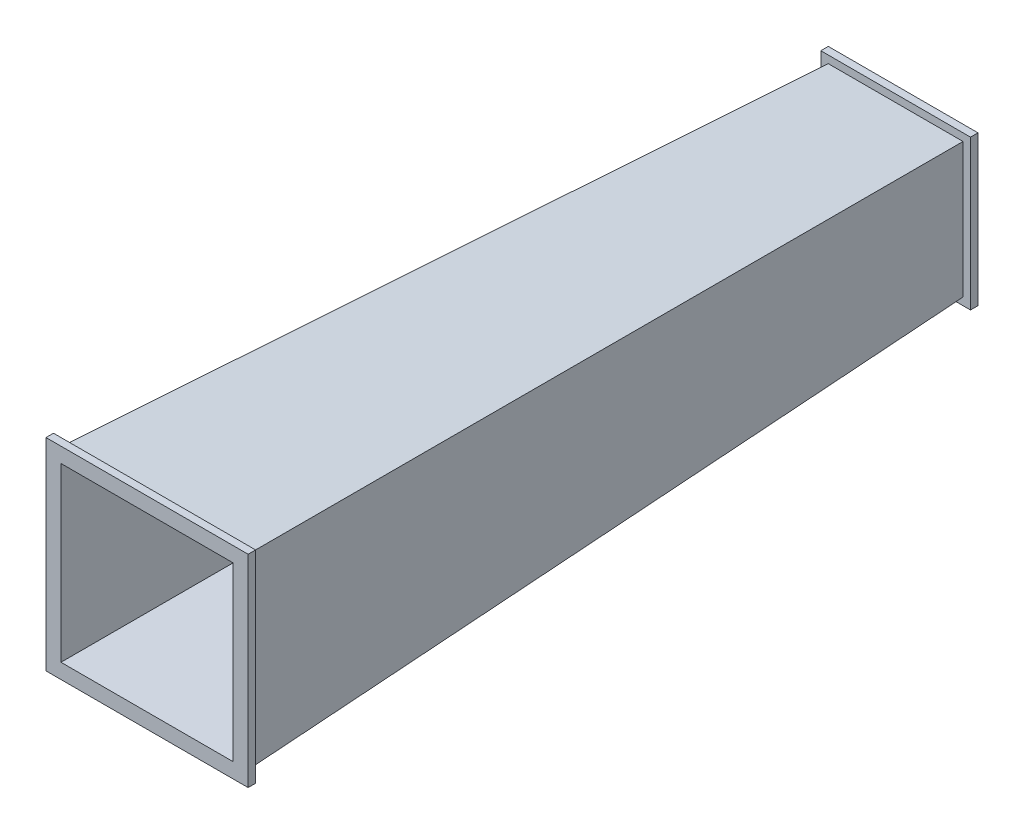
ISO-10303-21;
HEADER;
FILE_DESCRIPTION(('STEP AP214'),'2;1');
FILE_NAME('part.step','',(''),(''),'','','');
FILE_SCHEMA(('AUTOMOTIVE_DESIGN { 1 0 10303 214 1 1 1 1 }'));
ENDSEC;
DATA;
#1=APPLICATION_CONTEXT('core data for automotive mechanical design processes');
#2=APPLICATION_PROTOCOL_DEFINITION('international standard','automotive_design',2000,#1);
#3=PRODUCT_CONTEXT('',#1,'mechanical');
#4=PRODUCT('Part','Part','',(#3));
#5=PRODUCT_RELATED_PRODUCT_CATEGORY('part','',(#4));
#6=PRODUCT_DEFINITION_FORMATION('','',#4);
#7=PRODUCT_DEFINITION_CONTEXT('part definition',#1,'design');
#8=PRODUCT_DEFINITION('design','',#6,#7);
#9=PRODUCT_DEFINITION_SHAPE('','',#8);
#10=(LENGTH_UNIT() NAMED_UNIT(*) SI_UNIT(.MILLI.,.METRE.));
#11=(NAMED_UNIT(*) PLANE_ANGLE_UNIT() SI_UNIT($,.RADIAN.));
#12=(NAMED_UNIT(*) SI_UNIT($,.STERADIAN.) SOLID_ANGLE_UNIT());
#13=UNCERTAINTY_MEASURE_WITH_UNIT(LENGTH_MEASURE(1.E-05),#10,'distance_accuracy_value','');
#14=(GEOMETRIC_REPRESENTATION_CONTEXT(3) GLOBAL_UNCERTAINTY_ASSIGNED_CONTEXT((#13)) GLOBAL_UNIT_ASSIGNED_CONTEXT((#10,
#11,#12)) REPRESENTATION_CONTEXT('',''));
#15=CARTESIAN_POINT('',(0.,0.,0.));
#16=DIRECTION('',(0.,0.,1.));
#17=DIRECTION('',(1.,0.,0.));
#18=AXIS2_PLACEMENT_3D('',#15,#16,#17);
#19=CARTESIAN_POINT('',(0.,0.,-5.));
#20=DIRECTION('',(0.,0.,-1.));
#21=DIRECTION('',(-1.,0.,0.));
#22=AXIS2_PLACEMENT_3D('',#19,#20,#21);
#23=PLANE('',#22);
#24=DIRECTION('',(0.,1.,0.));
#25=VECTOR('',#24,1.);
#26=CARTESIAN_POINT('',(-50.,-50.,-5.));
#27=LINE('',#26,#25);
#28=CARTESIAN_POINT('',(-50.,-50.,-5.));
#29=VERTEX_POINT('',#28);
#30=CARTESIAN_POINT('',(-50.,50.,-5.));
#31=VERTEX_POINT('',#30);
#32=EDGE_CURVE('E160',#29,#31,#27,.T.);
#33=ORIENTED_EDGE('',*,*,#32,.T.);
#34=DIRECTION('',(1.,0.,0.));
#35=VECTOR('',#34,1.);
#36=CARTESIAN_POINT('',(-50.,50.,-5.));
#37=LINE('',#36,#35);
#38=CARTESIAN_POINT('',(50.,50.,-5.));
#39=VERTEX_POINT('',#38);
#40=EDGE_CURVE('E163',#31,#39,#37,.T.);
#41=ORIENTED_EDGE('',*,*,#40,.T.);
#42=DIRECTION('',(0.,-1.,0.));
#43=VECTOR('',#42,1.);
#44=CARTESIAN_POINT('',(50.,50.,-5.));
#45=LINE('',#44,#43);
#46=CARTESIAN_POINT('',(50.,-50.,-5.));
#47=VERTEX_POINT('',#46);
#48=EDGE_CURVE('E166',#39,#47,#45,.T.);
#49=ORIENTED_EDGE('',*,*,#48,.T.);
#50=DIRECTION('',(-1.,0.,0.));
#51=VECTOR('',#50,1.);
#52=CARTESIAN_POINT('',(50.,-50.,-5.));
#53=LINE('',#52,#51);
#54=EDGE_CURVE('E168',#47,#29,#53,.T.);
#55=ORIENTED_EDGE('',*,*,#54,.T.);
#56=EDGE_LOOP('',(#33,#41,#49,#55));
#57=FACE_BOUND('',#56,.T.);
#58=DIRECTION('',(0.,-1.,0.));
#59=VECTOR('',#58,1.);
#60=CARTESIAN_POINT('',(45.,45.,-5.));
#61=LINE('',#60,#59);
#62=CARTESIAN_POINT('',(45.,45.,-5.));
#63=VERTEX_POINT('',#62);
#64=CARTESIAN_POINT('',(45.,-45.,-5.));
#65=VERTEX_POINT('',#64);
#66=EDGE_CURVE('E132',#63,#65,#61,.T.);
#67=ORIENTED_EDGE('',*,*,#66,.F.);
#68=DIRECTION('',(1.,0.,0.));
#69=VECTOR('',#68,1.);
#70=CARTESIAN_POINT('',(-45.,45.,-5.));
#71=LINE('',#70,#69);
#72=CARTESIAN_POINT('',(-45.,45.,-5.));
#73=VERTEX_POINT('',#72);
#74=EDGE_CURVE('E124',#73,#63,#71,.T.);
#75=ORIENTED_EDGE('',*,*,#74,.F.);
#76=DIRECTION('',(0.,1.,0.));
#77=VECTOR('',#76,1.);
#78=CARTESIAN_POINT('',(-45.,-45.,-5.));
#79=LINE('',#78,#77);
#80=CARTESIAN_POINT('',(-45.,-45.,-5.));
#81=VERTEX_POINT('',#80);
#82=EDGE_CURVE('E146',#81,#73,#79,.T.);
#83=ORIENTED_EDGE('',*,*,#82,.F.);
#84=DIRECTION('',(-1.,0.,0.));
#85=VECTOR('',#84,1.);
#86=CARTESIAN_POINT('',(45.,-45.,-5.));
#87=LINE('',#86,#85);
#88=EDGE_CURVE('E144',#65,#81,#87,.T.);
#89=ORIENTED_EDGE('',*,*,#88,.F.);
#90=EDGE_LOOP('',(#67,#75,#83,#89));
#91=FACE_BOUND('',#90,.T.);
#92=ADVANCED_FACE('F59',(#57,#91),#23,.T.);
#93=CARTESIAN_POINT('',(0.,0.,0.));
#94=DIRECTION('',(0.,0.,-1.));
#95=DIRECTION('',(-1.,0.,0.));
#96=AXIS2_PLACEMENT_3D('',#93,#94,#95);
#97=PLANE('',#96);
#98=DIRECTION('',(0.,1.,0.));
#99=VECTOR('',#98,1.);
#100=CARTESIAN_POINT('',(-50.,-50.,0.));
#101=LINE('',#100,#99);
#102=CARTESIAN_POINT('',(-50.,-50.,0.));
#103=VERTEX_POINT('',#102);
#104=CARTESIAN_POINT('',(-50.,50.,0.));
#105=VERTEX_POINT('',#104);
#106=EDGE_CURVE('E140',#103,#105,#101,.T.);
#107=ORIENTED_EDGE('',*,*,#106,.F.);
#108=DIRECTION('',(-1.,0.,0.));
#109=VECTOR('',#108,1.);
#110=CARTESIAN_POINT('',(50.,-50.,0.));
#111=LINE('',#110,#109);
#112=CARTESIAN_POINT('',(50.,-50.,0.));
#113=VERTEX_POINT('',#112);
#114=EDGE_CURVE('E164',#113,#103,#111,.T.);
#115=ORIENTED_EDGE('',*,*,#114,.F.);
#116=DIRECTION('',(0.,-1.,0.));
#117=VECTOR('',#116,1.);
#118=CARTESIAN_POINT('',(50.,50.,0.));
#119=LINE('',#118,#117);
#120=CARTESIAN_POINT('',(50.,50.,0.));
#121=VERTEX_POINT('',#120);
#122=EDGE_CURVE('E175',#121,#113,#119,.T.);
#123=ORIENTED_EDGE('',*,*,#122,.F.);
#124=DIRECTION('',(1.,0.,0.));
#125=VECTOR('',#124,1.);
#126=CARTESIAN_POINT('',(-50.,50.,0.));
#127=LINE('',#126,#125);
#128=EDGE_CURVE('E173',#105,#121,#127,.T.);
#129=ORIENTED_EDGE('',*,*,#128,.F.);
#130=EDGE_LOOP('',(#107,#115,#123,#129));
#131=FACE_BOUND('',#130,.T.);
#132=DIRECTION('',(1.,0.,0.));
#133=VECTOR('',#132,1.);
#134=CARTESIAN_POINT('',(-45.,45.,0.));
#135=LINE('',#134,#133);
#136=CARTESIAN_POINT('',(-45.,45.,0.));
#137=VERTEX_POINT('',#136);
#138=CARTESIAN_POINT('',(45.,45.,0.));
#139=VERTEX_POINT('',#138);
#140=EDGE_CURVE('E82',#137,#139,#135,.T.);
#141=ORIENTED_EDGE('',*,*,#140,.T.);
#142=DIRECTION('',(0.,-1.,0.));
#143=VECTOR('',#142,1.);
#144=CARTESIAN_POINT('',(45.,45.,0.));
#145=LINE('',#144,#143);
#146=CARTESIAN_POINT('',(45.,-45.,0.));
#147=VERTEX_POINT('',#146);
#148=EDGE_CURVE('E139',#139,#147,#145,.T.);
#149=ORIENTED_EDGE('',*,*,#148,.T.);
#150=DIRECTION('',(-1.,0.,0.));
#151=VECTOR('',#150,1.);
#152=CARTESIAN_POINT('',(45.,-45.,0.));
#153=LINE('',#152,#151);
#154=CARTESIAN_POINT('',(-45.,-45.,0.));
#155=VERTEX_POINT('',#154);
#156=EDGE_CURVE('E152',#147,#155,#153,.T.);
#157=ORIENTED_EDGE('',*,*,#156,.T.);
#158=DIRECTION('',(0.,1.,0.));
#159=VECTOR('',#158,1.);
#160=CARTESIAN_POINT('',(-45.,-45.,0.));
#161=LINE('',#160,#159);
#162=EDGE_CURVE('E133',#155,#137,#161,.T.);
#163=ORIENTED_EDGE('',*,*,#162,.T.);
#164=EDGE_LOOP('',(#141,#149,#157,#163));
#165=FACE_BOUND('',#164,.T.);
#166=ADVANCED_FACE('F193',(#131,#165),#97,.F.);
#167=CARTESIAN_POINT('',(-50.,-50.,-5.));
#168=DIRECTION('',(1.,0.,0.));
#169=DIRECTION('',(0.,0.,-1.));
#170=AXIS2_PLACEMENT_3D('',#167,#168,#169);
#171=PLANE('',#170);
#172=ORIENTED_EDGE('',*,*,#106,.T.);
#173=DIRECTION('',(0.,0.,1.));
#174=VECTOR('',#173,1.);
#175=CARTESIAN_POINT('',(-50.,50.,-5.));
#176=LINE('',#175,#174);
#177=EDGE_CURVE('E13',#31,#105,#176,.T.);
#178=ORIENTED_EDGE('',*,*,#177,.F.);
#179=ORIENTED_EDGE('',*,*,#32,.F.);
#180=DIRECTION('',(0.,0.,1.));
#181=VECTOR('',#180,1.);
#182=CARTESIAN_POINT('',(-50.,-50.,-5.));
#183=LINE('',#182,#181);
#184=EDGE_CURVE('E170',#29,#103,#183,.T.);
#185=ORIENTED_EDGE('',*,*,#184,.T.);
#186=EDGE_LOOP('',(#172,#178,#179,#185));
#187=FACE_BOUND('',#186,.T.);
#188=ADVANCED_FACE('F61',(#187),#171,.F.);
#189=CARTESIAN_POINT('',(-50.,50.,-5.));
#190=DIRECTION('',(0.,-1.,0.));
#191=DIRECTION('',(0.,0.,-1.));
#192=AXIS2_PLACEMENT_3D('',#189,#190,#191);
#193=PLANE('',#192);
#194=ORIENTED_EDGE('',*,*,#128,.T.);
#195=DIRECTION('',(0.,0.,1.));
#196=VECTOR('',#195,1.);
#197=CARTESIAN_POINT('',(50.,50.,-5.));
#198=LINE('',#197,#196);
#199=EDGE_CURVE('E67',#39,#121,#198,.T.);
#200=ORIENTED_EDGE('',*,*,#199,.F.);
#201=ORIENTED_EDGE('',*,*,#40,.F.);
#202=ORIENTED_EDGE('',*,*,#177,.T.);
#203=EDGE_LOOP('',(#194,#200,#201,#202));
#204=FACE_BOUND('',#203,.T.);
#205=ADVANCED_FACE('F203',(#204),#193,.F.);
#206=CARTESIAN_POINT('',(50.,50.,-5.));
#207=DIRECTION('',(-1.,0.,0.));
#208=DIRECTION('',(0.,0.,1.));
#209=AXIS2_PLACEMENT_3D('',#206,#207,#208);
#210=PLANE('',#209);
#211=ORIENTED_EDGE('',*,*,#122,.T.);
#212=DIRECTION('',(0.,0.,1.));
#213=VECTOR('',#212,1.);
#214=CARTESIAN_POINT('',(50.,-50.,-5.));
#215=LINE('',#214,#213);
#216=EDGE_CURVE('E180',#47,#113,#215,.T.);
#217=ORIENTED_EDGE('',*,*,#216,.F.);
#218=ORIENTED_EDGE('',*,*,#48,.F.);
#219=ORIENTED_EDGE('',*,*,#199,.T.);
#220=EDGE_LOOP('',(#211,#217,#218,#219));
#221=FACE_BOUND('',#220,.T.);
#222=ADVANCED_FACE('F187',(#221),#210,.F.);
#223=CARTESIAN_POINT('',(50.,-50.,-5.));
#224=DIRECTION('',(0.,1.,0.));
#225=DIRECTION('',(0.,0.,1.));
#226=AXIS2_PLACEMENT_3D('',#223,#224,#225);
#227=PLANE('',#226);
#228=ORIENTED_EDGE('',*,*,#114,.T.);
#229=ORIENTED_EDGE('',*,*,#184,.F.);
#230=ORIENTED_EDGE('',*,*,#54,.F.);
#231=ORIENTED_EDGE('',*,*,#216,.T.);
#232=EDGE_LOOP('',(#228,#229,#230,#231));
#233=FACE_BOUND('',#232,.T.);
#234=ADVANCED_FACE('F197',(#233),#227,.F.);
#235=CARTESIAN_POINT('',(-45.,45.,-5.));
#236=DIRECTION('',(0.,-1.,0.));
#237=DIRECTION('',(0.,0.,-1.));
#238=AXIS2_PLACEMENT_3D('',#235,#236,#237);
#239=PLANE('',#238);
#240=ORIENTED_EDGE('',*,*,#140,.F.);
#241=DIRECTION('',(0.,0.,1.));
#242=VECTOR('',#241,1.);
#243=CARTESIAN_POINT('',(-45.,45.,-5.));
#244=LINE('',#243,#242);
#245=EDGE_CURVE('E128',#73,#137,#244,.T.);
#246=ORIENTED_EDGE('',*,*,#245,.F.);
#247=ORIENTED_EDGE('',*,*,#74,.T.);
#248=DIRECTION('',(0.,0.,1.));
#249=VECTOR('',#248,1.);
#250=CARTESIAN_POINT('',(45.,45.,-5.));
#251=LINE('',#250,#249);
#252=EDGE_CURVE('E127',#63,#139,#251,.T.);
#253=ORIENTED_EDGE('',*,*,#252,.T.);
#254=EDGE_LOOP('',(#240,#246,#247,#253));
#255=FACE_BOUND('',#254,.T.);
#256=ADVANCED_FACE('F126',(#255),#239,.T.);
#257=CARTESIAN_POINT('',(45.,45.,-5.));
#258=DIRECTION('',(-1.,0.,0.));
#259=DIRECTION('',(0.,-1.,0.));
#260=AXIS2_PLACEMENT_3D('',#257,#258,#259);
#261=PLANE('',#260);
#262=ORIENTED_EDGE('',*,*,#148,.F.);
#263=ORIENTED_EDGE('',*,*,#252,.F.);
#264=ORIENTED_EDGE('',*,*,#66,.T.);
#265=DIRECTION('',(0.,0.,1.));
#266=VECTOR('',#265,1.);
#267=CARTESIAN_POINT('',(45.,-45.,-5.));
#268=LINE('',#267,#266);
#269=EDGE_CURVE('E141',#65,#147,#268,.T.);
#270=ORIENTED_EDGE('',*,*,#269,.T.);
#271=EDGE_LOOP('',(#262,#263,#264,#270));
#272=FACE_BOUND('',#271,.T.);
#273=ADVANCED_FACE('F136',(#272),#261,.T.);
#274=CARTESIAN_POINT('',(45.,-45.,-5.));
#275=DIRECTION('',(0.,1.,0.));
#276=DIRECTION('',(-1.,0.,0.));
#277=AXIS2_PLACEMENT_3D('',#274,#275,#276);
#278=PLANE('',#277);
#279=ORIENTED_EDGE('',*,*,#156,.F.);
#280=ORIENTED_EDGE('',*,*,#269,.F.);
#281=ORIENTED_EDGE('',*,*,#88,.T.);
#282=DIRECTION('',(0.,0.,1.));
#283=VECTOR('',#282,1.);
#284=CARTESIAN_POINT('',(-45.,-45.,-5.));
#285=LINE('',#284,#283);
#286=EDGE_CURVE('E74',#81,#155,#285,.T.);
#287=ORIENTED_EDGE('',*,*,#286,.T.);
#288=EDGE_LOOP('',(#279,#280,#281,#287));
#289=FACE_BOUND('',#288,.T.);
#290=ADVANCED_FACE('F226',(#289),#278,.T.);
#291=CARTESIAN_POINT('',(-45.,-45.,-5.));
#292=DIRECTION('',(1.,0.,0.));
#293=DIRECTION('',(0.,1.,0.));
#294=AXIS2_PLACEMENT_3D('',#291,#292,#293);
#295=PLANE('',#294);
#296=ORIENTED_EDGE('',*,*,#162,.F.);
#297=ORIENTED_EDGE('',*,*,#286,.F.);
#298=ORIENTED_EDGE('',*,*,#82,.T.);
#299=ORIENTED_EDGE('',*,*,#245,.T.);
#300=EDGE_LOOP('',(#296,#297,#298,#299));
#301=FACE_BOUND('',#300,.T.);
#302=ADVANCED_FACE('F230',(#301),#295,.T.);
#303=CLOSED_SHELL('',(#92,#166,#188,#205,#222,#234,#256,#273,#290,#302));
#304=MANIFOLD_SOLID_BREP('B2',#303);
#305=CARTESIAN_POINT('',(44.9449424455043,0.,-1.57307298559265));
#306=DIRECTION('',(0.999388062160532,0.,-0.0349785821756186));
#307=DIRECTION('',(-0.0349785821756186,0.,-0.999388062160532));
#308=AXIS2_PLACEMENT_3D('',#305,#306,#307);
#309=PLANE('',#308);
#310=DIRECTION('',(-0.0349572036223083,-0.0349572036223083,-0.998777246351666));
#311=VECTOR('',#310,1.);
#312=CARTESIAN_POINT('',(62.5,62.5,500.));
#313=LINE('',#312,#311);
#314=CARTESIAN_POINT('',(62.325,62.325,495.));
#315=VERTEX_POINT('',#314);
#316=CARTESIAN_POINT('',(45.,45.,0.));
#317=VERTEX_POINT('',#316);
#318=EDGE_CURVE('E293',#315,#317,#313,.T.);
#319=ORIENTED_EDGE('',*,*,#318,.F.);
#320=DIRECTION('',(0.,-1.,0.));
#321=VECTOR('',#320,1.);
#322=CARTESIAN_POINT('',(62.325,0.,495.));
#323=LINE('',#322,#321);
#324=CARTESIAN_POINT('',(62.325,-62.325,495.));
#325=VERTEX_POINT('',#324);
#326=EDGE_CURVE('E427',#315,#325,#323,.T.);
#327=ORIENTED_EDGE('',*,*,#326,.T.);
#328=DIRECTION('',(-0.0349572036223083,0.0349572036223083,-0.998777246351666));
#329=VECTOR('',#328,1.);
#330=CARTESIAN_POINT('',(62.5,-62.5,500.));
#331=LINE('',#330,#329);
#332=CARTESIAN_POINT('',(45.,-45.,0.));
#333=VERTEX_POINT('',#332);
#334=EDGE_CURVE('E451',#325,#333,#331,.T.);
#335=ORIENTED_EDGE('',*,*,#334,.T.);
#336=DIRECTION('',(0.,1.,0.));
#337=VECTOR('',#336,1.);
#338=CARTESIAN_POINT('',(45.,45.,0.));
#339=LINE('',#338,#337);
#340=EDGE_CURVE('E469',#333,#317,#339,.T.);
#341=ORIENTED_EDGE('',*,*,#340,.T.);
#342=EDGE_LOOP('',(#319,#327,#335,#341));
#343=FACE_BOUND('',#342,.T.);
#344=ADVANCED_FACE('F289',(#343),#309,.T.);
#345=CARTESIAN_POINT('',(0.,44.9449424455043,-1.57307298559265));
#346=DIRECTION('',(0.,0.999388062160532,-0.0349785821756186));
#347=DIRECTION('',(0.,0.0349785821756186,0.999388062160532));
#348=AXIS2_PLACEMENT_3D('',#345,#346,#347);
#349=PLANE('',#348);
#350=DIRECTION('',(0.0349572036223083,-0.0349572036223083,-0.998777246351666));
#351=VECTOR('',#350,1.);
#352=CARTESIAN_POINT('',(-62.5,62.5,500.));
#353=LINE('',#352,#351);
#354=CARTESIAN_POINT('',(-62.325,62.325,495.));
#355=VERTEX_POINT('',#354);
#356=CARTESIAN_POINT('',(-45.,45.,0.));
#357=VERTEX_POINT('',#356);
#358=EDGE_CURVE('E466',#355,#357,#353,.T.);
#359=ORIENTED_EDGE('',*,*,#358,.F.);
#360=DIRECTION('',(1.,0.,0.));
#361=VECTOR('',#360,1.);
#362=CARTESIAN_POINT('',(0.,62.325,495.));
#363=LINE('',#362,#361);
#364=EDGE_CURVE('E307',#355,#315,#363,.T.);
#365=ORIENTED_EDGE('',*,*,#364,.T.);
#366=ORIENTED_EDGE('',*,*,#318,.T.);
#367=DIRECTION('',(-1.,0.,0.));
#368=VECTOR('',#367,1.);
#369=CARTESIAN_POINT('',(-45.,45.,0.));
#370=LINE('',#369,#368);
#371=EDGE_CURVE('E299',#317,#357,#370,.T.);
#372=ORIENTED_EDGE('',*,*,#371,.T.);
#373=EDGE_LOOP('',(#359,#365,#366,#372));
#374=FACE_BOUND('',#373,.T.);
#375=ADVANCED_FACE('F499',(#374),#349,.T.);
#376=CARTESIAN_POINT('',(0.,-44.9449424455043,-1.57307298559265));
#377=DIRECTION('',(0.,-0.999388062160532,-0.0349785821756186));
#378=DIRECTION('',(0.,0.0349785821756186,-0.999388062160532));
#379=AXIS2_PLACEMENT_3D('',#376,#377,#378);
#380=PLANE('',#379);
#381=ORIENTED_EDGE('',*,*,#334,.F.);
#382=DIRECTION('',(-1.,0.,0.));
#383=VECTOR('',#382,1.);
#384=CARTESIAN_POINT('',(0.,-62.325,495.));
#385=LINE('',#384,#383);
#386=CARTESIAN_POINT('',(-62.325,-62.325,495.));
#387=VERTEX_POINT('',#386);
#388=EDGE_CURVE('E420',#325,#387,#385,.T.);
#389=ORIENTED_EDGE('',*,*,#388,.T.);
#390=DIRECTION('',(0.0349572036223083,0.0349572036223083,-0.998777246351666));
#391=VECTOR('',#390,1.);
#392=CARTESIAN_POINT('',(-62.5,-62.5,500.));
#393=LINE('',#392,#391);
#394=CARTESIAN_POINT('',(-45.,-45.,0.));
#395=VERTEX_POINT('',#394);
#396=EDGE_CURVE('E470',#387,#395,#393,.T.);
#397=ORIENTED_EDGE('',*,*,#396,.T.);
#398=DIRECTION('',(1.,0.,0.));
#399=VECTOR('',#398,1.);
#400=CARTESIAN_POINT('',(-45.,-45.,0.));
#401=LINE('',#400,#399);
#402=EDGE_CURVE('E478',#395,#333,#401,.T.);
#403=ORIENTED_EDGE('',*,*,#402,.T.);
#404=EDGE_LOOP('',(#381,#389,#397,#403));
#405=FACE_BOUND('',#404,.T.);
#406=ADVANCED_FACE('F504',(#405),#380,.T.);
#407=CARTESIAN_POINT('',(-44.9449424455043,0.,-1.57307298559265));
#408=DIRECTION('',(-0.999388062160532,0.,-0.0349785821756186));
#409=DIRECTION('',(-0.0349785821756186,0.,0.999388062160532));
#410=AXIS2_PLACEMENT_3D('',#407,#408,#409);
#411=PLANE('',#410);
#412=ORIENTED_EDGE('',*,*,#396,.F.);
#413=DIRECTION('',(0.,1.,0.));
#414=VECTOR('',#413,1.);
#415=CARTESIAN_POINT('',(-62.325,0.,495.));
#416=LINE('',#415,#414);
#417=EDGE_CURVE('E57',#387,#355,#416,.T.);
#418=ORIENTED_EDGE('',*,*,#417,.T.);
#419=ORIENTED_EDGE('',*,*,#358,.T.);
#420=DIRECTION('',(0.,-1.,0.));
#421=VECTOR('',#420,1.);
#422=CARTESIAN_POINT('',(-45.,45.,0.));
#423=LINE('',#422,#421);
#424=EDGE_CURVE('E475',#357,#395,#423,.T.);
#425=ORIENTED_EDGE('',*,*,#424,.T.);
#426=EDGE_LOOP('',(#412,#418,#419,#425));
#427=FACE_BOUND('',#426,.T.);
#428=ADVANCED_FACE('F502',(#427),#411,.T.);
#429=CARTESIAN_POINT('',(0.,0.,0.));
#430=DIRECTION('',(0.,0.,1.));
#431=DIRECTION('',(1.,0.,0.));
#432=AXIS2_PLACEMENT_3D('',#429,#430,#431);
#433=PLANE('',#432);
#434=DIRECTION('',(1.,0.,0.));
#435=VECTOR('',#434,1.);
#436=CARTESIAN_POINT('',(0.,-39.9969384373166,0.));
#437=LINE('',#436,#435);
#438=CARTESIAN_POINT('',(-39.9969384373166,-39.9969384373166,0.));
#439=VERTEX_POINT('',#438);
#440=CARTESIAN_POINT('',(39.9969384373166,-39.9969384373166,0.));
#441=VERTEX_POINT('',#440);
#442=EDGE_CURVE('E444',#439,#441,#437,.T.);
#443=ORIENTED_EDGE('',*,*,#442,.T.);
#444=DIRECTION('',(0.,1.,0.));
#445=VECTOR('',#444,1.);
#446=CARTESIAN_POINT('',(39.9969384373166,0.,0.));
#447=LINE('',#446,#445);
#448=CARTESIAN_POINT('',(39.9969384373166,39.9969384373166,0.));
#449=VERTEX_POINT('',#448);
#450=EDGE_CURVE('E440',#441,#449,#447,.T.);
#451=ORIENTED_EDGE('',*,*,#450,.T.);
#452=DIRECTION('',(-1.,0.,0.));
#453=VECTOR('',#452,1.);
#454=CARTESIAN_POINT('',(0.,39.9969384373166,0.));
#455=LINE('',#454,#453);
#456=CARTESIAN_POINT('',(-39.9969384373166,39.9969384373166,0.));
#457=VERTEX_POINT('',#456);
#458=EDGE_CURVE('E448',#449,#457,#455,.T.);
#459=ORIENTED_EDGE('',*,*,#458,.T.);
#460=DIRECTION('',(0.,-1.,0.));
#461=VECTOR('',#460,1.);
#462=CARTESIAN_POINT('',(-39.9969384373166,0.,0.));
#463=LINE('',#462,#461);
#464=EDGE_CURVE('E314',#457,#439,#463,.T.);
#465=ORIENTED_EDGE('',*,*,#464,.T.);
#466=EDGE_LOOP('',(#443,#451,#459,#465));
#467=FACE_BOUND('',#466,.T.);
#468=ORIENTED_EDGE('',*,*,#340,.F.);
#469=ORIENTED_EDGE('',*,*,#402,.F.);
#470=ORIENTED_EDGE('',*,*,#424,.F.);
#471=ORIENTED_EDGE('',*,*,#371,.F.);
#472=EDGE_LOOP('',(#468,#469,#470,#471));
#473=FACE_BOUND('',#472,.T.);
#474=ADVANCED_FACE('F291',(#467,#473),#433,.F.);
#475=CARTESIAN_POINT('',(0.,0.,500.));
#476=DIRECTION('',(0.,0.,1.));
#477=DIRECTION('',(1.,0.,0.));
#478=AXIS2_PLACEMENT_3D('',#475,#476,#477);
#479=PLANE('',#478);
#480=DIRECTION('',(0.,1.,0.));
#481=VECTOR('',#480,1.);
#482=CARTESIAN_POINT('',(57.4969384373166,0.,500.));
#483=LINE('',#482,#481);
#484=CARTESIAN_POINT('',(57.4969384373166,-57.4969384373166,500.));
#485=VERTEX_POINT('',#484);
#486=CARTESIAN_POINT('',(57.4969384373166,57.4969384373166,500.));
#487=VERTEX_POINT('',#486);
#488=EDGE_CURVE('E430',#485,#487,#483,.T.);
#489=ORIENTED_EDGE('',*,*,#488,.F.);
#490=DIRECTION('',(1.,0.,0.));
#491=VECTOR('',#490,1.);
#492=CARTESIAN_POINT('',(0.,-57.4969384373166,500.));
#493=LINE('',#492,#491);
#494=CARTESIAN_POINT('',(-57.4969384373166,-57.4969384373166,500.));
#495=VERTEX_POINT('',#494);
#496=EDGE_CURVE('E454',#495,#485,#493,.T.);
#497=ORIENTED_EDGE('',*,*,#496,.F.);
#498=DIRECTION('',(0.,-1.,0.));
#499=VECTOR('',#498,1.);
#500=CARTESIAN_POINT('',(-57.4969384373166,0.,500.));
#501=LINE('',#500,#499);
#502=CARTESIAN_POINT('',(-57.4969384373166,57.4969384373166,500.));
#503=VERTEX_POINT('',#502);
#504=EDGE_CURVE('E456',#503,#495,#501,.T.);
#505=ORIENTED_EDGE('',*,*,#504,.F.);
#506=DIRECTION('',(-1.,0.,0.));
#507=VECTOR('',#506,1.);
#508=CARTESIAN_POINT('',(0.,57.4969384373166,500.));
#509=LINE('',#508,#507);
#510=EDGE_CURVE('E434',#487,#503,#509,.T.);
#511=ORIENTED_EDGE('',*,*,#510,.F.);
#512=EDGE_LOOP('',(#489,#497,#505,#511));
#513=FACE_BOUND('',#512,.T.);
#514=DIRECTION('',(1.,0.,0.));
#515=VECTOR('',#514,1.);
#516=CARTESIAN_POINT('',(0.,-67.5,500.));
#517=LINE('',#516,#515);
#518=CARTESIAN_POINT('',(-67.5,-67.5,500.));
#519=VERTEX_POINT('',#518);
#520=CARTESIAN_POINT('',(67.5,-67.5,500.));
#521=VERTEX_POINT('',#520);
#522=EDGE_CURVE('E414',#519,#521,#517,.T.);
#523=ORIENTED_EDGE('',*,*,#522,.T.);
#524=DIRECTION('',(0.,1.,0.));
#525=VECTOR('',#524,1.);
#526=CARTESIAN_POINT('',(67.5,0.,500.));
#527=LINE('',#526,#525);
#528=CARTESIAN_POINT('',(67.5,67.5,500.));
#529=VERTEX_POINT('',#528);
#530=EDGE_CURVE('E386',#521,#529,#527,.T.);
#531=ORIENTED_EDGE('',*,*,#530,.T.);
#532=DIRECTION('',(-1.,0.,0.));
#533=VECTOR('',#532,1.);
#534=CARTESIAN_POINT('',(0.,67.5,500.));
#535=LINE('',#534,#533);
#536=CARTESIAN_POINT('',(-67.5,67.5,500.));
#537=VERTEX_POINT('',#536);
#538=EDGE_CURVE('E409',#529,#537,#535,.T.);
#539=ORIENTED_EDGE('',*,*,#538,.T.);
#540=DIRECTION('',(0.,-1.,0.));
#541=VECTOR('',#540,1.);
#542=CARTESIAN_POINT('',(-67.5,0.,500.));
#543=LINE('',#542,#541);
#544=EDGE_CURVE('E406',#537,#519,#543,.T.);
#545=ORIENTED_EDGE('',*,*,#544,.T.);
#546=EDGE_LOOP('',(#523,#531,#539,#545));
#547=FACE_BOUND('',#546,.T.);
#548=ADVANCED_FACE('F518',(#513,#547),#479,.T.);
#549=CARTESIAN_POINT('',(39.9480021347016,0.,-1.39818007471456));
#550=DIRECTION('',(0.999388062160532,0.,-0.0349785821756186));
#551=DIRECTION('',(-0.0349785821756186,0.,-0.999388062160532));
#552=AXIS2_PLACEMENT_3D('',#549,#550,#551);
#553=PLANE('',#552);
#554=DIRECTION('',(-0.0349572036223083,0.0349572036223083,-0.998777246351666));
#555=VECTOR('',#554,1.);
#556=CARTESIAN_POINT('',(39.8991854330057,-39.8991854330057,-2.7929429803104));
#557=LINE('',#556,#555);
#558=EDGE_CURVE('E431',#485,#441,#557,.T.);
#559=ORIENTED_EDGE('',*,*,#558,.F.);
#560=ORIENTED_EDGE('',*,*,#488,.T.);
#561=DIRECTION('',(-0.0349572036223083,-0.0349572036223083,-0.998777246351666));
#562=VECTOR('',#561,1.);
#563=CARTESIAN_POINT('',(39.8991854330057,39.8991854330057,-2.7929429803104));
#564=LINE('',#563,#562);
#565=EDGE_CURVE('E433',#487,#449,#564,.T.);
#566=ORIENTED_EDGE('',*,*,#565,.T.);
#567=ORIENTED_EDGE('',*,*,#450,.F.);
#568=EDGE_LOOP('',(#559,#560,#566,#567));
#569=FACE_BOUND('',#568,.T.);
#570=ADVANCED_FACE('F521',(#569),#553,.F.);
#571=CARTESIAN_POINT('',(0.,39.9480021347016,-1.39818007471456));
#572=DIRECTION('',(0.,0.999388062160532,-0.0349785821756186));
#573=DIRECTION('',(0.,0.0349785821756186,0.999388062160532));
#574=AXIS2_PLACEMENT_3D('',#571,#572,#573);
#575=PLANE('',#574);
#576=ORIENTED_EDGE('',*,*,#565,.F.);
#577=ORIENTED_EDGE('',*,*,#510,.T.);
#578=DIRECTION('',(0.0349572036223083,-0.0349572036223083,-0.998777246351666));
#579=VECTOR('',#578,1.);
#580=CARTESIAN_POINT('',(-39.8991854330058,39.8991854330057,-2.7929429803104));
#581=LINE('',#580,#579);
#582=EDGE_CURVE('E438',#503,#457,#581,.T.);
#583=ORIENTED_EDGE('',*,*,#582,.T.);
#584=ORIENTED_EDGE('',*,*,#458,.F.);
#585=EDGE_LOOP('',(#576,#577,#583,#584));
#586=FACE_BOUND('',#585,.T.);
#587=ADVANCED_FACE('F528',(#586),#575,.F.);
#588=CARTESIAN_POINT('',(0.,-39.9480021347016,-1.39818007471456));
#589=DIRECTION('',(0.,-0.999388062160532,-0.0349785821756186));
#590=DIRECTION('',(0.,0.0349785821756186,-0.999388062160532));
#591=AXIS2_PLACEMENT_3D('',#588,#589,#590);
#592=PLANE('',#591);
#593=DIRECTION('',(0.0349572036223083,0.0349572036223083,-0.998777246351666));
#594=VECTOR('',#593,1.);
#595=CARTESIAN_POINT('',(-39.8991854330057,-39.8991854330057,-2.7929429803104));
#596=LINE('',#595,#594);
#597=EDGE_CURVE('E437',#495,#439,#596,.T.);
#598=ORIENTED_EDGE('',*,*,#597,.F.);
#599=ORIENTED_EDGE('',*,*,#496,.T.);
#600=ORIENTED_EDGE('',*,*,#558,.T.);
#601=ORIENTED_EDGE('',*,*,#442,.F.);
#602=EDGE_LOOP('',(#598,#599,#600,#601));
#603=FACE_BOUND('',#602,.T.);
#604=ADVANCED_FACE('F525',(#603),#592,.F.);
#605=CARTESIAN_POINT('',(-39.9480021347016,0.,-1.39818007471455));
#606=DIRECTION('',(-0.999388062160532,0.,-0.0349785821756186));
#607=DIRECTION('',(-0.0349785821756186,0.,0.999388062160532));
#608=AXIS2_PLACEMENT_3D('',#605,#606,#607);
#609=PLANE('',#608);
#610=ORIENTED_EDGE('',*,*,#582,.F.);
#611=ORIENTED_EDGE('',*,*,#504,.T.);
#612=ORIENTED_EDGE('',*,*,#597,.T.);
#613=ORIENTED_EDGE('',*,*,#464,.F.);
#614=EDGE_LOOP('',(#610,#611,#612,#613));
#615=FACE_BOUND('',#614,.T.);
#616=ADVANCED_FACE('F523',(#615),#609,.F.);
#617=CARTESIAN_POINT('',(0.,-67.5,495.));
#618=DIRECTION('',(0.,-1.,0.));
#619=DIRECTION('',(0.,0.,-1.));
#620=AXIS2_PLACEMENT_3D('',#617,#618,#619);
#621=PLANE('',#620);
#622=ORIENTED_EDGE('',*,*,#522,.F.);
#623=DIRECTION('',(0.,0.,1.));
#624=VECTOR('',#623,1.);
#625=CARTESIAN_POINT('',(-67.5,-67.5,495.));
#626=LINE('',#625,#624);
#627=CARTESIAN_POINT('',(-67.5,-67.5,495.));
#628=VERTEX_POINT('',#627);
#629=EDGE_CURVE('E405',#628,#519,#626,.T.);
#630=ORIENTED_EDGE('',*,*,#629,.F.);
#631=DIRECTION('',(1.,0.,0.));
#632=VECTOR('',#631,1.);
#633=CARTESIAN_POINT('',(0.,-67.5,495.));
#634=LINE('',#633,#632);
#635=CARTESIAN_POINT('',(67.5,-67.5,495.));
#636=VERTEX_POINT('',#635);
#637=EDGE_CURVE('E399',#628,#636,#634,.T.);
#638=ORIENTED_EDGE('',*,*,#637,.T.);
#639=DIRECTION('',(0.,0.,1.));
#640=VECTOR('',#639,1.);
#641=CARTESIAN_POINT('',(67.5,-67.5,495.));
#642=LINE('',#641,#640);
#643=EDGE_CURVE('E381',#636,#521,#642,.T.);
#644=ORIENTED_EDGE('',*,*,#643,.T.);
#645=EDGE_LOOP('',(#622,#630,#638,#644));
#646=FACE_BOUND('',#645,.T.);
#647=ADVANCED_FACE('F404',(#646),#621,.T.);
#648=CARTESIAN_POINT('',(-67.5,0.,495.));
#649=DIRECTION('',(-1.,0.,0.));
#650=DIRECTION('',(0.,0.,1.));
#651=AXIS2_PLACEMENT_3D('',#648,#649,#650);
#652=PLANE('',#651);
#653=ORIENTED_EDGE('',*,*,#544,.F.);
#654=DIRECTION('',(0.,0.,1.));
#655=VECTOR('',#654,1.);
#656=CARTESIAN_POINT('',(-67.5,67.5,495.));
#657=LINE('',#656,#655);
#658=CARTESIAN_POINT('',(-67.5,67.5,495.));
#659=VERTEX_POINT('',#658);
#660=EDGE_CURVE('E421',#659,#537,#657,.T.);
#661=ORIENTED_EDGE('',*,*,#660,.F.);
#662=DIRECTION('',(0.,-1.,0.));
#663=VECTOR('',#662,1.);
#664=CARTESIAN_POINT('',(-67.5,0.,495.));
#665=LINE('',#664,#663);
#666=EDGE_CURVE('E392',#659,#628,#665,.T.);
#667=ORIENTED_EDGE('',*,*,#666,.T.);
#668=ORIENTED_EDGE('',*,*,#629,.T.);
#669=EDGE_LOOP('',(#653,#661,#667,#668));
#670=FACE_BOUND('',#669,.T.);
#671=ADVANCED_FACE('F538',(#670),#652,.T.);
#672=CARTESIAN_POINT('',(0.,67.5,495.));
#673=DIRECTION('',(0.,1.,0.));
#674=DIRECTION('',(0.,0.,1.));
#675=AXIS2_PLACEMENT_3D('',#672,#673,#674);
#676=PLANE('',#675);
#677=ORIENTED_EDGE('',*,*,#538,.F.);
#678=DIRECTION('',(0.,0.,1.));
#679=VECTOR('',#678,1.);
#680=CARTESIAN_POINT('',(67.5,67.5,495.));
#681=LINE('',#680,#679);
#682=CARTESIAN_POINT('',(67.5,67.5,495.));
#683=VERTEX_POINT('',#682);
#684=EDGE_CURVE('E391',#683,#529,#681,.T.);
#685=ORIENTED_EDGE('',*,*,#684,.F.);
#686=DIRECTION('',(-1.,0.,0.));
#687=VECTOR('',#686,1.);
#688=CARTESIAN_POINT('',(0.,67.5,495.));
#689=LINE('',#688,#687);
#690=EDGE_CURVE('E402',#683,#659,#689,.T.);
#691=ORIENTED_EDGE('',*,*,#690,.T.);
#692=ORIENTED_EDGE('',*,*,#660,.T.);
#693=EDGE_LOOP('',(#677,#685,#691,#692));
#694=FACE_BOUND('',#693,.T.);
#695=ADVANCED_FACE('F541',(#694),#676,.T.);
#696=CARTESIAN_POINT('',(67.5,0.,495.));
#697=DIRECTION('',(1.,0.,0.));
#698=DIRECTION('',(0.,0.,-1.));
#699=AXIS2_PLACEMENT_3D('',#696,#697,#698);
#700=PLANE('',#699);
#701=ORIENTED_EDGE('',*,*,#530,.F.);
#702=ORIENTED_EDGE('',*,*,#643,.F.);
#703=DIRECTION('',(0.,1.,0.));
#704=VECTOR('',#703,1.);
#705=CARTESIAN_POINT('',(67.5,0.,495.));
#706=LINE('',#705,#704);
#707=EDGE_CURVE('E384',#636,#683,#706,.T.);
#708=ORIENTED_EDGE('',*,*,#707,.T.);
#709=ORIENTED_EDGE('',*,*,#684,.T.);
#710=EDGE_LOOP('',(#701,#702,#708,#709));
#711=FACE_BOUND('',#710,.T.);
#712=ADVANCED_FACE('F383',(#711),#700,.T.);
#713=CARTESIAN_POINT('',(0.,0.,495.));
#714=DIRECTION('',(0.,0.,1.));
#715=DIRECTION('',(1.,0.,0.));
#716=AXIS2_PLACEMENT_3D('',#713,#714,#715);
#717=PLANE('',#716);
#718=ORIENTED_EDGE('',*,*,#326,.F.);
#719=ORIENTED_EDGE('',*,*,#364,.F.);
#720=ORIENTED_EDGE('',*,*,#417,.F.);
#721=ORIENTED_EDGE('',*,*,#388,.F.);
#722=EDGE_LOOP('',(#718,#719,#720,#721));
#723=FACE_BOUND('',#722,.T.);
#724=ORIENTED_EDGE('',*,*,#637,.F.);
#725=ORIENTED_EDGE('',*,*,#666,.F.);
#726=ORIENTED_EDGE('',*,*,#690,.F.);
#727=ORIENTED_EDGE('',*,*,#707,.F.);
#728=EDGE_LOOP('',(#724,#725,#726,#727));
#729=FACE_BOUND('',#728,.T.);
#730=ADVANCED_FACE('F397',(#723,#729),#717,.F.);
#731=CLOSED_SHELL('',(#344,#375,#406,#428,#474,#548,#570,#587,#604,#616,#647,#671,#695,#712,#730));
#732=MANIFOLD_SOLID_BREP('B7',#731);
#733=ADVANCED_BREP_SHAPE_REPRESENTATION('',(#18,#304,#732),#14);
#734=SHAPE_DEFINITION_REPRESENTATION(#9,#733);
ENDSEC;
END-ISO-10303-21;
